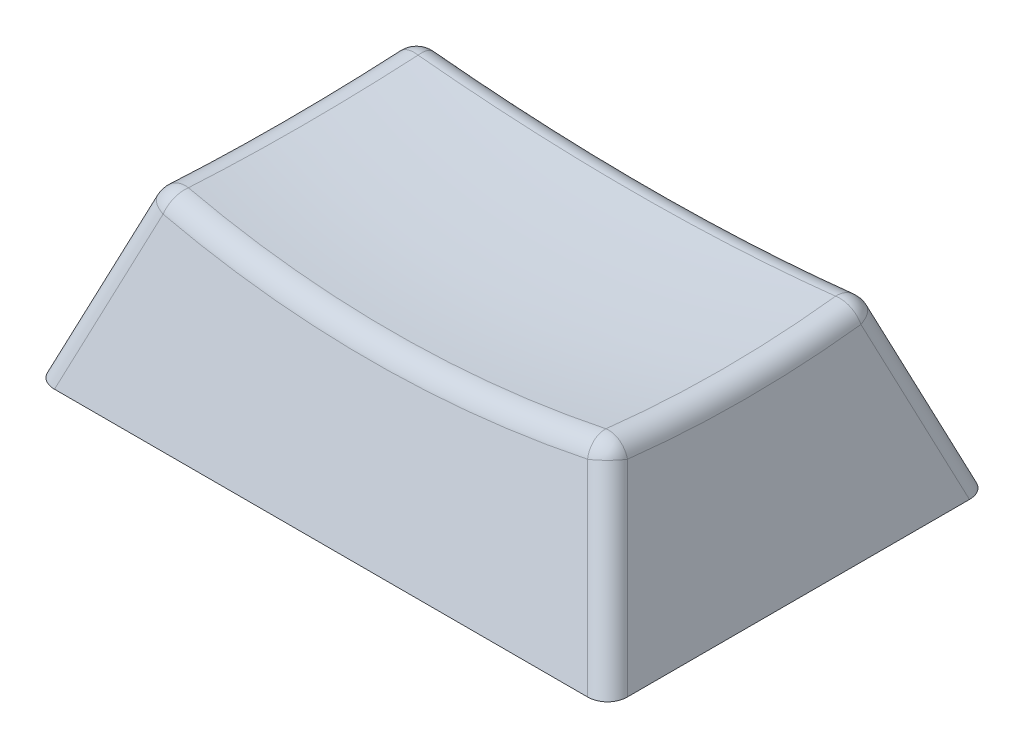
ISO-10303-21;
HEADER;
FILE_DESCRIPTION(('STEP AP214'),'2;1');
FILE_NAME('part.step','',(''),(''),'','','');
FILE_SCHEMA(('AUTOMOTIVE_DESIGN { 1 0 10303 214 1 1 1 1 }'));
ENDSEC;
DATA;
#1=APPLICATION_CONTEXT('core data for automotive mechanical design processes');
#2=APPLICATION_PROTOCOL_DEFINITION('international standard','automotive_design',2000,#1);
#3=PRODUCT_CONTEXT('',#1,'mechanical');
#4=PRODUCT('Part','Part','',(#3));
#5=PRODUCT_RELATED_PRODUCT_CATEGORY('part','',(#4));
#6=PRODUCT_DEFINITION_FORMATION('','',#4);
#7=PRODUCT_DEFINITION_CONTEXT('part definition',#1,'design');
#8=PRODUCT_DEFINITION('design','',#6,#7);
#9=PRODUCT_DEFINITION_SHAPE('','',#8);
#10=(LENGTH_UNIT() NAMED_UNIT(*) SI_UNIT(.MILLI.,.METRE.));
#11=(NAMED_UNIT(*) PLANE_ANGLE_UNIT() SI_UNIT($,.RADIAN.));
#12=(NAMED_UNIT(*) SI_UNIT($,.STERADIAN.) SOLID_ANGLE_UNIT());
#13=UNCERTAINTY_MEASURE_WITH_UNIT(LENGTH_MEASURE(1.E-05),#10,'distance_accuracy_value','');
#14=(GEOMETRIC_REPRESENTATION_CONTEXT(3) GLOBAL_UNCERTAINTY_ASSIGNED_CONTEXT((#13)) GLOBAL_UNIT_ASSIGNED_CONTEXT((#10,
#11,#12)) REPRESENTATION_CONTEXT('',''));
#15=CARTESIAN_POINT('',(0.,0.,0.));
#16=DIRECTION('',(0.,0.,1.));
#17=DIRECTION('',(1.,0.,0.));
#18=AXIS2_PLACEMENT_3D('',#15,#16,#17);
#19=CARTESIAN_POINT('',(-13.5,0.,9.));
#20=DIRECTION('',(-0.941470544812038,0.337095258423083,0.));
#21=DIRECTION('',(-0.337095258423083,-0.941470544812038,0.));
#22=AXIS2_PLACEMENT_3D('',#19,#20,#21);
#23=PLANE('',#22);
#24=DIRECTION('',(0.,0.,1.));
#25=VECTOR('',#24,1.);
#26=CARTESIAN_POINT('',(-13.5,0.,9.));
#27=LINE('',#26,#25);
#28=CARTESIAN_POINT('',(-13.5,0.,-8.05852945518796));
#29=VERTEX_POINT('',#28);
#30=CARTESIAN_POINT('',(-13.5,0.,8.05852945518797));
#31=VERTEX_POINT('',#30);
#32=EDGE_CURVE('E332',#29,#31,#27,.T.);
#33=ORIENTED_EDGE('',*,*,#32,.T.);
#34=DIRECTION('',(0.319434306340419,0.892145418564502,-0.31943430634042));
#35=VECTOR('',#34,1.);
#36=CARTESIAN_POINT('',(-13.5960660313607,-0.268302020343255,8.15459548654862));
#37=LINE('',#36,#35);
#38=CARTESIAN_POINT('',(-10.9418788490455,7.14455529558839,5.50040830423342));
#39=VERTEX_POINT('',#38);
#40=EDGE_CURVE('E364',#31,#39,#37,.T.);
#41=ORIENTED_EDGE('',*,*,#40,.T.);
#42=CARTESIAN_POINT('',(9.21190225068364,63.4318829807803,0.));
#43=DIRECTION('',(-0.941470544812038,0.337095258423083,0.));
#44=DIRECTION('',(-0.337095258423083,-0.941470544812038,0.));
#45=AXIS2_PLACEMENT_3D('',#42,#43,#44);
#46=CIRCLE('',#45,60.0390926153056);
#47=CARTESIAN_POINT('',(-10.9418788490455,7.14455529558838,-5.50040830423342));
#48=VERTEX_POINT('',#47);
#49=EDGE_CURVE('E360',#39,#48,#46,.F.);
#50=ORIENTED_EDGE('',*,*,#49,.T.);
#51=DIRECTION('',(0.319434306340419,0.892145418564502,0.319434306340419));
#52=VECTOR('',#51,1.);
#53=CARTESIAN_POINT('',(-11.7593770621513,4.86137133246757,-6.31790651733928));
#54=LINE('',#53,#52);
#55=EDGE_CURVE('E362',#48,#29,#54,.F.);
#56=ORIENTED_EDGE('',*,*,#55,.T.);
#57=EDGE_LOOP('',(#33,#41,#50,#56));
#58=FACE_BOUND('',#57,.T.);
#59=ADVANCED_FACE('F35',(#58),#23,.T.);
#60=CARTESIAN_POINT('',(13.5,0.,9.));
#61=DIRECTION('',(0.,0.337095258423083,0.941470544812038));
#62=DIRECTION('',(0.,-0.941470544812038,0.337095258423083));
#63=AXIS2_PLACEMENT_3D('',#60,#61,#62);
#64=PLANE('',#63);
#65=CARTESIAN_POINT('',(0.,62.0037393260752,-13.2005527910527));
#66=DIRECTION('',(0.,0.337095258423083,0.941470544812038));
#67=DIRECTION('',(0.,-0.941470544812038,0.337095258423083));
#68=AXIS2_PLACEMENT_3D('',#65,#66,#67);
#69=CIRCLE('',#68,59.1215980795354);
#70=CARTESIAN_POINT('',(10.0004083042334,7.14455529558838,6.44187884904546));
#71=VERTEX_POINT('',#70);
#72=CARTESIAN_POINT('',(-10.0004083042334,7.14455529558838,6.44187884904546));
#73=VERTEX_POINT('',#72);
#74=EDGE_CURVE('E347',#71,#73,#69,.F.);
#75=ORIENTED_EDGE('',*,*,#74,.T.);
#76=DIRECTION('',(0.31943430634042,0.892145418564502,-0.31943430634042));
#77=VECTOR('',#76,1.);
#78=CARTESIAN_POINT('',(-9.89956203273462,7.42620800887299,6.34103257754666));
#79=LINE('',#78,#77);
#80=CARTESIAN_POINT('',(-12.558529455188,0.,9.));
#81=VERTEX_POINT('',#80);
#82=EDGE_CURVE('E349',#73,#81,#79,.F.);
#83=ORIENTED_EDGE('',*,*,#82,.T.);
#84=DIRECTION('',(1.,0.,0.));
#85=VECTOR('',#84,1.);
#86=CARTESIAN_POINT('',(13.5,0.,9.));
#87=LINE('',#86,#85);
#88=CARTESIAN_POINT('',(12.558529455188,0.,9.));
#89=VERTEX_POINT('',#88);
#90=EDGE_CURVE('E335',#81,#89,#87,.T.);
#91=ORIENTED_EDGE('',*,*,#90,.T.);
#92=DIRECTION('',(-0.319434306340419,0.892145418564502,-0.319434306340419));
#93=VECTOR('',#92,1.);
#94=CARTESIAN_POINT('',(12.6545954865486,-0.268302020343255,9.09606603136065));
#95=LINE('',#94,#93);
#96=EDGE_CURVE('E345',#89,#71,#95,.T.);
#97=ORIENTED_EDGE('',*,*,#96,.T.);
#98=EDGE_LOOP('',(#75,#83,#91,#97));
#99=FACE_BOUND('',#98,.T.);
#100=ADVANCED_FACE('F455',(#99),#64,.T.);
#101=CARTESIAN_POINT('',(13.5,0.,9.));
#102=DIRECTION('',(0.941470544812038,0.337095258423083,0.));
#103=DIRECTION('',(-0.337095258423083,0.941470544812038,0.));
#104=AXIS2_PLACEMENT_3D('',#101,#102,#103);
#105=PLANE('',#104);
#106=CARTESIAN_POINT('',(-9.21190225068363,63.4318829807803,0.));
#107=DIRECTION('',(0.941470544812038,0.337095258423083,0.));
#108=DIRECTION('',(-0.337095258423083,0.941470544812038,0.));
#109=AXIS2_PLACEMENT_3D('',#106,#107,#108);
#110=CIRCLE('',#109,60.0390926153056);
#111=CARTESIAN_POINT('',(10.9418788490455,7.14455529558838,-5.50040830423342));
#112=VERTEX_POINT('',#111);
#113=CARTESIAN_POINT('',(10.9418788490455,7.14455529558838,5.50040830423342));
#114=VERTEX_POINT('',#113);
#115=EDGE_CURVE('E383',#112,#114,#110,.F.);
#116=ORIENTED_EDGE('',*,*,#115,.T.);
#117=DIRECTION('',(-0.319434306340419,0.892145418564502,-0.319434306340419));
#118=VECTOR('',#117,1.);
#119=CARTESIAN_POINT('',(13.5960660313607,-0.268302020343255,8.15459548654862));
#120=LINE('',#119,#118);
#121=CARTESIAN_POINT('',(13.5,0.,8.05852945518796));
#122=VERTEX_POINT('',#121);
#123=EDGE_CURVE('E43',#114,#122,#120,.F.);
#124=ORIENTED_EDGE('',*,*,#123,.T.);
#125=DIRECTION('',(0.,0.,-1.));
#126=VECTOR('',#125,1.);
#127=CARTESIAN_POINT('',(13.5,0.,9.));
#128=LINE('',#127,#126);
#129=CARTESIAN_POINT('',(13.5,0.,-8.05852945518796));
#130=VERTEX_POINT('',#129);
#131=EDGE_CURVE('E339',#122,#130,#128,.T.);
#132=ORIENTED_EDGE('',*,*,#131,.T.);
#133=DIRECTION('',(-0.319434306340419,0.892145418564502,0.31943430634042));
#134=VECTOR('',#133,1.);
#135=CARTESIAN_POINT('',(11.7593770621513,4.86137133246757,-6.31790651733929));
#136=LINE('',#135,#134);
#137=EDGE_CURVE('E381',#130,#112,#136,.T.);
#138=ORIENTED_EDGE('',*,*,#137,.T.);
#139=EDGE_LOOP('',(#116,#124,#132,#138));
#140=FACE_BOUND('',#139,.T.);
#141=ADVANCED_FACE('F443',(#140),#105,.T.);
#142=CARTESIAN_POINT('',(13.5,0.,-9.));
#143=DIRECTION('',(0.,0.337095258423083,-0.941470544812038));
#144=DIRECTION('',(0.,0.941470544812038,0.337095258423083));
#145=AXIS2_PLACEMENT_3D('',#142,#143,#144);
#146=PLANE('',#145);
#147=DIRECTION('',(-1.,0.,0.));
#148=VECTOR('',#147,1.);
#149=CARTESIAN_POINT('',(13.5,0.,-9.));
#150=LINE('',#149,#148);
#151=CARTESIAN_POINT('',(12.558529455188,0.,-9.));
#152=VERTEX_POINT('',#151);
#153=CARTESIAN_POINT('',(-12.558529455188,0.,-9.));
#154=VERTEX_POINT('',#153);
#155=EDGE_CURVE('E342',#152,#154,#150,.T.);
#156=ORIENTED_EDGE('',*,*,#155,.T.);
#157=DIRECTION('',(0.319434306340419,0.892145418564502,0.319434306340419));
#158=VECTOR('',#157,1.);
#159=CARTESIAN_POINT('',(-9.89956203273462,7.42620800887298,-6.34103257754666));
#160=LINE('',#159,#158);
#161=CARTESIAN_POINT('',(-10.0004083042334,7.14455529558838,-6.44187884904546));
#162=VERTEX_POINT('',#161);
#163=EDGE_CURVE('E370',#154,#162,#160,.T.);
#164=ORIENTED_EDGE('',*,*,#163,.T.);
#165=CARTESIAN_POINT('',(0.,62.0037393260752,13.2005527910527));
#166=DIRECTION('',(0.,0.337095258423083,-0.941470544812038));
#167=DIRECTION('',(0.,0.941470544812038,0.337095258423083));
#168=AXIS2_PLACEMENT_3D('',#165,#166,#167);
#169=CIRCLE('',#168,59.1215980795354);
#170=CARTESIAN_POINT('',(10.0004083042334,7.14455529558839,-6.44187884904545));
#171=VERTEX_POINT('',#170);
#172=EDGE_CURVE('E368',#162,#171,#169,.F.);
#173=ORIENTED_EDGE('',*,*,#172,.T.);
#174=DIRECTION('',(-0.31943430634042,0.892145418564502,0.31943430634042));
#175=VECTOR('',#174,1.);
#176=CARTESIAN_POINT('',(12.6545954865486,-0.268302020343256,-9.09606603136065));
#177=LINE('',#176,#175);
#178=EDGE_CURVE('E366',#171,#152,#177,.F.);
#179=ORIENTED_EDGE('',*,*,#178,.T.);
#180=EDGE_LOOP('',(#156,#164,#173,#179));
#181=FACE_BOUND('',#180,.T.);
#182=ADVANCED_FACE('F498',(#181),#146,.T.);
#183=CARTESIAN_POINT('',(0.,0.,0.));
#184=DIRECTION('',(0.,1.,0.));
#185=DIRECTION('',(0.,0.,1.));
#186=AXIS2_PLACEMENT_3D('',#183,#184,#185);
#187=PLANE('',#186);
#188=DIRECTION('',(0.,0.,-1.));
#189=VECTOR('',#188,1.);
#190=CARTESIAN_POINT('',(-11.9067478177987,0.,9.));
#191=LINE('',#190,#189);
#192=CARTESIAN_POINT('',(-11.9067478177987,0.,-7.40674781779872));
#193=VERTEX_POINT('',#192);
#194=CARTESIAN_POINT('',(-11.9067478177987,0.,7.40674781779873));
#195=VERTEX_POINT('',#194);
#196=EDGE_CURVE('E318',#193,#195,#191,.F.);
#197=ORIENTED_EDGE('',*,*,#196,.T.);
#198=DIRECTION('',(-1.,0.,0.));
#199=VECTOR('',#198,1.);
#200=CARTESIAN_POINT('',(13.5,0.,7.40674781779873));
#201=LINE('',#200,#199);
#202=CARTESIAN_POINT('',(11.9067478177987,0.,7.40674781779873));
#203=VERTEX_POINT('',#202);
#204=EDGE_CURVE('E326',#195,#203,#201,.F.);
#205=ORIENTED_EDGE('',*,*,#204,.T.);
#206=DIRECTION('',(0.,0.,1.));
#207=VECTOR('',#206,1.);
#208=CARTESIAN_POINT('',(11.9067478177987,0.,9.));
#209=LINE('',#208,#207);
#210=CARTESIAN_POINT('',(11.9067478177987,0.,-7.40674781779873));
#211=VERTEX_POINT('',#210);
#212=EDGE_CURVE('E328',#203,#211,#209,.F.);
#213=ORIENTED_EDGE('',*,*,#212,.T.);
#214=DIRECTION('',(1.,0.,0.));
#215=VECTOR('',#214,1.);
#216=CARTESIAN_POINT('',(13.5,0.,-7.40674781779873));
#217=LINE('',#216,#215);
#218=EDGE_CURVE('E214',#211,#193,#217,.F.);
#219=ORIENTED_EDGE('',*,*,#218,.T.);
#220=EDGE_LOOP('',(#197,#205,#213,#219));
#221=FACE_BOUND('',#220,.T.);
#222=ORIENTED_EDGE('',*,*,#90,.F.);
#223=CARTESIAN_POINT('',(-12.4378318785325,0.,7.93783187853249));
#224=DIRECTION('',(0.,1.,0.));
#225=DIRECTION('',(-0.707106781186547,0.,0.707106781186548));
#226=AXIS2_PLACEMENT_3D('',#223,#224,#225);
#227=ELLIPSE('',#226,1.12089349918878,1.);
#228=EDGE_CURVE('E358',#81,#31,#227,.F.);
#229=ORIENTED_EDGE('',*,*,#228,.T.);
#230=ORIENTED_EDGE('',*,*,#32,.F.);
#231=CARTESIAN_POINT('',(-12.4378318785325,0.,-7.93783187853248));
#232=DIRECTION('',(0.,1.,0.));
#233=DIRECTION('',(-0.707106781186548,0.,-0.707106781186547));
#234=AXIS2_PLACEMENT_3D('',#231,#232,#233);
#235=ELLIPSE('',#234,1.12089349918878,1.);
#236=EDGE_CURVE('E356',#29,#154,#235,.F.);
#237=ORIENTED_EDGE('',*,*,#236,.T.);
#238=ORIENTED_EDGE('',*,*,#155,.F.);
#239=CARTESIAN_POINT('',(12.4378318785325,0.,-7.93783187853249));
#240=DIRECTION('',(0.,1.,0.));
#241=DIRECTION('',(0.707106781186547,0.,-0.707106781186548));
#242=AXIS2_PLACEMENT_3D('',#239,#240,#241);
#243=ELLIPSE('',#242,1.12089349918878,1.);
#244=EDGE_CURVE('E352',#152,#130,#243,.F.);
#245=ORIENTED_EDGE('',*,*,#244,.T.);
#246=ORIENTED_EDGE('',*,*,#131,.F.);
#247=CARTESIAN_POINT('',(12.4378318785325,0.,7.93783187853249));
#248=DIRECTION('',(0.,1.,0.));
#249=DIRECTION('',(0.707106781186548,0.,0.707106781186547));
#250=AXIS2_PLACEMENT_3D('',#247,#248,#249);
#251=ELLIPSE('',#250,1.12089349918878,1.);
#252=EDGE_CURVE('E354',#122,#89,#251,.F.);
#253=ORIENTED_EDGE('',*,*,#252,.T.);
#254=EDGE_LOOP('',(#222,#229,#230,#237,#238,#245,#246,#253));
#255=FACE_BOUND('',#254,.T.);
#256=ADVANCED_FACE('F453',(#221,#255),#187,.F.);
#257=CARTESIAN_POINT('',(0.,66.7302215075393,0.));
#258=DIRECTION('',(0.866197194455934,0.,0.499702331710259));
#259=DIRECTION('',(0.,1.,0.));
#260=AXIS2_PLACEMENT_3D('',#257,#258,#259);
#261=SPHERICAL_SURFACE('',#260,60.);
#262=CARTESIAN_POINT('',(0.,61.7496535338797,13.9101868877358));
#263=DIRECTION('',(0.,0.337095258423083,-0.941470544812038));
#264=DIRECTION('',(0.,0.941470544812038,0.337095258423083));
#265=AXIS2_PLACEMENT_3D('',#262,#263,#264);
#266=CIRCLE('',#265,58.1523915536414);
#267=CARTESIAN_POINT('',(9.83646718449188,7.78980038913865,-5.41023767629517));
#268=VERTEX_POINT('',#267);
#269=CARTESIAN_POINT('',(-9.83646718449189,7.78980038913864,-5.41023767629517));
#270=VERTEX_POINT('',#269);
#271=EDGE_CURVE('E372',#268,#270,#266,.T.);
#272=ORIENTED_EDGE('',*,*,#271,.T.);
#273=CARTESIAN_POINT('',(9.98692406114328,63.1543849975241,0.));
#274=DIRECTION('',(-0.941470544812038,0.337095258423083,0.));
#275=DIRECTION('',(-0.337095258423083,-0.941470544812038,0.));
#276=AXIS2_PLACEMENT_3D('',#273,#274,#275);
#277=CIRCLE('',#276,59.0548451953826);
#278=CARTESIAN_POINT('',(-9.83646718449189,7.78980038913864,5.41023767629517));
#279=VERTEX_POINT('',#278);
#280=EDGE_CURVE('E378',#270,#279,#277,.T.);
#281=ORIENTED_EDGE('',*,*,#280,.T.);
#282=CARTESIAN_POINT('',(0.,61.7496535338797,-13.9101868877358));
#283=DIRECTION('',(0.,0.337095258423083,0.941470544812038));
#284=DIRECTION('',(0.,-0.941470544812038,0.337095258423083));
#285=AXIS2_PLACEMENT_3D('',#282,#283,#284);
#286=CIRCLE('',#285,58.1523915536414);
#287=CARTESIAN_POINT('',(9.83646718449189,7.78980038913865,5.41023767629517));
#288=VERTEX_POINT('',#287);
#289=EDGE_CURVE('E376',#279,#288,#286,.T.);
#290=ORIENTED_EDGE('',*,*,#289,.T.);
#291=CARTESIAN_POINT('',(-9.98692406114329,63.1543849975241,0.));
#292=DIRECTION('',(0.941470544812038,0.337095258423083,0.));
#293=DIRECTION('',(-0.337095258423083,0.941470544812038,0.));
#294=AXIS2_PLACEMENT_3D('',#291,#292,#293);
#295=CIRCLE('',#294,59.0548451953826);
#296=EDGE_CURVE('E374',#288,#268,#295,.T.);
#297=ORIENTED_EDGE('',*,*,#296,.T.);
#298=EDGE_LOOP('',(#272,#281,#290,#297));
#299=FACE_BOUND('',#298,.T.);
#300=ADVANCED_FACE('F434',(#299),#261,.F.);
#301=CARTESIAN_POINT('',(12.6545954865486,-0.605397278766338,-8.15459548654862));
#302=DIRECTION('',(0.31943430634042,-0.892145418564502,-0.31943430634042));
#303=DIRECTION('',(0.,0.337095258423083,-0.941470544812038));
#304=AXIS2_PLACEMENT_3D('',#301,#302,#303);
#305=CYLINDRICAL_SURFACE('',#304,1.);
#306=CARTESIAN_POINT('',(10.0004083042334,6.80746003716529,-5.50040830423342));
#307=DIRECTION('',(-0.319434306340419,0.892145418564498,0.319434306340431));
#308=DIRECTION('',(0.,-0.337095258423095,0.941470544812033));
#309=AXIS2_PLACEMENT_3D('',#306,#307,#308);
#310=CIRCLE('',#309,1.);
#311=EDGE_CURVE('E336',#112,#171,#310,.T.);
#312=ORIENTED_EDGE('',*,*,#311,.F.);
#313=ORIENTED_EDGE('',*,*,#137,.F.);
#314=ORIENTED_EDGE('',*,*,#244,.F.);
#315=ORIENTED_EDGE('',*,*,#178,.F.);
#316=EDGE_LOOP('',(#312,#313,#314,#315));
#317=FACE_BOUND('',#316,.T.);
#318=ADVANCED_FACE('F37',(#317),#305,.T.);
#319=CARTESIAN_POINT('',(10.0004083042334,6.80746003716531,-5.50040830423342));
#320=DIRECTION('',(0.,0.,1.));
#321=DIRECTION('',(1.,0.,0.));
#322=AXIS2_PLACEMENT_3D('',#319,#320,#321);
#323=SPHERICAL_SURFACE('',#322,1.);
#324=CARTESIAN_POINT('',(10.0004083042334,6.8074600371653,-5.50040830423342));
#325=DIRECTION('',(-0.0308825713044701,0.0862516766543405,-0.99579461490005));
#326=DIRECTION('',(0.,0.996269816035879,0.0862928366426554));
#327=AXIS2_PLACEMENT_3D('',#324,#325,#326);
#328=CIRCLE('',#327,1.);
#329=EDGE_CURVE('E411',#112,#268,#328,.F.);
#330=ORIENTED_EDGE('',*,*,#329,.F.);
#331=ORIENTED_EDGE('',*,*,#311,.T.);
#332=CARTESIAN_POINT('',(10.0004083042334,6.8074600371653,-5.50040830423342));
#333=DIRECTION('',(0.985590348361583,0.159249583237987,0.0570196058827256));
#334=DIRECTION('',(-0.159509095156087,0.987196458949528,0.));
#335=AXIS2_PLACEMENT_3D('',#332,#333,#334);
#336=CIRCLE('',#335,1.);
#337=EDGE_CURVE('E414',#268,#171,#336,.F.);
#338=ORIENTED_EDGE('',*,*,#337,.F.);
#339=EDGE_LOOP('',(#330,#331,#338));
#340=FACE_BOUND('',#339,.T.);
#341=ADVANCED_FACE('F421',(#340),#323,.T.);
#342=CARTESIAN_POINT('',(-10.8179065173393,4.52427607404449,-6.31790651733929));
#343=DIRECTION('',(-0.31943430634042,-0.892145418564502,-0.319434306340419));
#344=DIRECTION('',(0.941470544812038,-0.337095258423083,0.));
#345=AXIS2_PLACEMENT_3D('',#342,#343,#344);
#346=CYLINDRICAL_SURFACE('',#345,1.);
#347=ORIENTED_EDGE('',*,*,#236,.F.);
#348=ORIENTED_EDGE('',*,*,#55,.F.);
#349=CARTESIAN_POINT('',(-10.0004083042334,6.80746003716529,-5.50040830423342));
#350=DIRECTION('',(0.319434306340422,0.892145418564501,0.31943430634042));
#351=DIRECTION('',(-0.941470544812037,0.337095258423085,0.));
#352=AXIS2_PLACEMENT_3D('',#349,#350,#351);
#353=CIRCLE('',#352,1.);
#354=EDGE_CURVE('E408',#162,#48,#353,.T.);
#355=ORIENTED_EDGE('',*,*,#354,.F.);
#356=ORIENTED_EDGE('',*,*,#163,.F.);
#357=EDGE_LOOP('',(#347,#348,#355,#356));
#358=FACE_BOUND('',#357,.T.);
#359=ADVANCED_FACE('F469',(#358),#346,.T.);
#360=CARTESIAN_POINT('',(0.,61.6666440676521,14.1420233358647));
#361=DIRECTION('',(0.,0.337095258423083,-0.941470544812038));
#362=DIRECTION('',(0.,0.941470544812038,0.337095258423083));
#363=AXIS2_PLACEMENT_3D('',#360,#361,#362);
#364=TOROIDAL_SURFACE('',#363,59.1215980795354,1.);
#365=ORIENTED_EDGE('',*,*,#337,.T.);
#366=ORIENTED_EDGE('',*,*,#172,.F.);
#367=CARTESIAN_POINT('',(-10.0004083042334,6.8074600371653,-5.50040830423342));
#368=DIRECTION('',(-0.985590348361584,0.159249583237982,0.0570196058827236));
#369=DIRECTION('',(-0.159509095156082,-0.987196458949528,0.));
#370=AXIS2_PLACEMENT_3D('',#367,#368,#369);
#371=CIRCLE('',#370,1.);
#372=EDGE_CURVE('E405',#270,#162,#371,.T.);
#373=ORIENTED_EDGE('',*,*,#372,.F.);
#374=ORIENTED_EDGE('',*,*,#271,.F.);
#375=EDGE_LOOP('',(#365,#366,#373,#374));
#376=FACE_BOUND('',#375,.T.);
#377=ADVANCED_FACE('F429',(#376),#364,.T.);
#378=CARTESIAN_POINT('',(-10.1533727954957,63.0947877223572,0.));
#379=DIRECTION('',(0.941470544812038,0.337095258423083,0.));
#380=DIRECTION('',(-0.337095258423083,0.941470544812038,0.));
#381=AXIS2_PLACEMENT_3D('',#378,#379,#380);
#382=TOROIDAL_SURFACE('',#381,60.0390926153056,1.);
#383=ORIENTED_EDGE('',*,*,#329,.T.);
#384=ORIENTED_EDGE('',*,*,#296,.F.);
#385=CARTESIAN_POINT('',(10.0004083042334,6.80746003716529,5.50040830423342));
#386=DIRECTION('',(-0.030882571304473,0.0862516766543395,0.99579461490005));
#387=DIRECTION('',(0.,-0.996269816035879,0.0862928366426544));
#388=AXIS2_PLACEMENT_3D('',#385,#386,#387);
#389=CIRCLE('',#388,1.);
#390=EDGE_CURVE('E402',#114,#288,#389,.T.);
#391=ORIENTED_EDGE('',*,*,#390,.F.);
#392=ORIENTED_EDGE('',*,*,#115,.F.);
#393=EDGE_LOOP('',(#383,#384,#391,#392));
#394=FACE_BOUND('',#393,.T.);
#395=ADVANCED_FACE('F440',(#394),#382,.T.);
#396=CARTESIAN_POINT('',(12.6545954865486,-0.605397278766338,8.15459548654862));
#397=DIRECTION('',(0.31943430634042,-0.892145418564502,0.319434306340419));
#398=DIRECTION('',(0.941470544812038,0.337095258423083,0.));
#399=AXIS2_PLACEMENT_3D('',#396,#397,#398);
#400=CYLINDRICAL_SURFACE('',#399,1.);
#401=ORIENTED_EDGE('',*,*,#252,.F.);
#402=ORIENTED_EDGE('',*,*,#123,.F.);
#403=CARTESIAN_POINT('',(10.0004083042334,6.8074600371653,5.50040830423342));
#404=DIRECTION('',(-0.319434306340412,0.892145418564504,-0.31943430634042));
#405=DIRECTION('',(0.,0.337095258423083,0.941470544812038));
#406=AXIS2_PLACEMENT_3D('',#403,#404,#405);
#407=CIRCLE('',#406,1.);
#408=EDGE_CURVE('E399',#71,#114,#407,.T.);
#409=ORIENTED_EDGE('',*,*,#408,.F.);
#410=ORIENTED_EDGE('',*,*,#96,.F.);
#411=EDGE_LOOP('',(#401,#402,#409,#410));
#412=FACE_BOUND('',#411,.T.);
#413=ADVANCED_FACE('F448',(#412),#400,.T.);
#414=CARTESIAN_POINT('',(-10.0004083042334,6.8074600371653,-5.50040830423342));
#415=DIRECTION('',(0.,0.,1.));
#416=DIRECTION('',(1.,0.,0.));
#417=AXIS2_PLACEMENT_3D('',#414,#415,#416);
#418=SPHERICAL_SURFACE('',#417,1.);
#419=ORIENTED_EDGE('',*,*,#372,.T.);
#420=ORIENTED_EDGE('',*,*,#354,.T.);
#421=CARTESIAN_POINT('',(-10.0004083042334,6.8074600371653,-5.50040830423342));
#422=DIRECTION('',(0.0308825713044717,0.0862516766543359,-0.995794614900051));
#423=DIRECTION('',(0.,0.996269816035879,0.0862928366426507));
#424=AXIS2_PLACEMENT_3D('',#421,#422,#423);
#425=CIRCLE('',#424,1.);
#426=EDGE_CURVE('E396',#270,#48,#425,.F.);
#427=ORIENTED_EDGE('',*,*,#426,.F.);
#428=EDGE_LOOP('',(#419,#420,#427));
#429=FACE_BOUND('',#428,.T.);
#430=ADVANCED_FACE('F472',(#429),#418,.T.);
#431=CARTESIAN_POINT('',(10.0004083042334,6.80746003716531,5.50040830423342));
#432=DIRECTION('',(0.,0.,1.));
#433=DIRECTION('',(1.,0.,0.));
#434=AXIS2_PLACEMENT_3D('',#431,#432,#433);
#435=SPHERICAL_SURFACE('',#434,1.);
#436=ORIENTED_EDGE('',*,*,#408,.T.);
#437=ORIENTED_EDGE('',*,*,#390,.T.);
#438=CARTESIAN_POINT('',(10.0004083042334,6.80746003716531,5.50040830423342));
#439=DIRECTION('',(0.985590348361584,0.159249583237982,-0.0570196058827245));
#440=DIRECTION('',(-0.159509095156082,0.987196458949528,0.));
#441=AXIS2_PLACEMENT_3D('',#438,#439,#440);
#442=CIRCLE('',#441,1.);
#443=EDGE_CURVE('E393',#71,#288,#442,.F.);
#444=ORIENTED_EDGE('',*,*,#443,.F.);
#445=EDGE_LOOP('',(#436,#437,#444));
#446=FACE_BOUND('',#445,.T.);
#447=ADVANCED_FACE('F480',(#446),#435,.T.);
#448=CARTESIAN_POINT('',(10.1533727954957,63.0947877223572,0.));
#449=DIRECTION('',(-0.941470544812038,0.337095258423083,0.));
#450=DIRECTION('',(-0.337095258423083,-0.941470544812038,0.));
#451=AXIS2_PLACEMENT_3D('',#448,#449,#450);
#452=TOROIDAL_SURFACE('',#451,60.0390926153056,1.);
#453=ORIENTED_EDGE('',*,*,#426,.T.);
#454=ORIENTED_EDGE('',*,*,#49,.F.);
#455=CARTESIAN_POINT('',(-10.0004083042334,6.8074600371653,5.50040830423342));
#456=DIRECTION('',(0.0308825713044729,0.0862516766543401,0.99579461490005));
#457=DIRECTION('',(0.,-0.996269816035879,0.0862928366426549));
#458=AXIS2_PLACEMENT_3D('',#455,#456,#457);
#459=CIRCLE('',#458,1.);
#460=EDGE_CURVE('E390',#279,#39,#459,.T.);
#461=ORIENTED_EDGE('',*,*,#460,.F.);
#462=ORIENTED_EDGE('',*,*,#280,.F.);
#463=EDGE_LOOP('',(#453,#454,#461,#462));
#464=FACE_BOUND('',#463,.T.);
#465=ADVANCED_FACE('F474',(#464),#452,.T.);
#466=CARTESIAN_POINT('',(0.,61.6666440676521,-14.1420233358647));
#467=DIRECTION('',(0.,0.337095258423083,0.941470544812038));
#468=DIRECTION('',(0.,-0.941470544812038,0.337095258423083));
#469=AXIS2_PLACEMENT_3D('',#466,#467,#468);
#470=TOROIDAL_SURFACE('',#469,59.1215980795354,1.);
#471=ORIENTED_EDGE('',*,*,#443,.T.);
#472=ORIENTED_EDGE('',*,*,#289,.F.);
#473=CARTESIAN_POINT('',(-10.0004083042334,6.8074600371653,5.50040830423342));
#474=DIRECTION('',(-0.985590348361584,0.159249583237978,-0.0570196058827226));
#475=DIRECTION('',(-0.159509095156078,-0.987196458949529,0.));
#476=AXIS2_PLACEMENT_3D('',#473,#474,#475);
#477=CIRCLE('',#476,1.);
#478=EDGE_CURVE('E388',#73,#279,#477,.T.);
#479=ORIENTED_EDGE('',*,*,#478,.F.);
#480=ORIENTED_EDGE('',*,*,#74,.F.);
#481=EDGE_LOOP('',(#471,#472,#479,#480));
#482=FACE_BOUND('',#481,.T.);
#483=ADVANCED_FACE('F478',(#482),#470,.T.);
#484=CARTESIAN_POINT('',(-10.0004083042334,6.8074600371653,5.50040830423342));
#485=DIRECTION('',(0.,0.,1.));
#486=DIRECTION('',(1.,0.,0.));
#487=AXIS2_PLACEMENT_3D('',#484,#485,#486);
#488=SPHERICAL_SURFACE('',#487,1.);
#489=ORIENTED_EDGE('',*,*,#478,.T.);
#490=ORIENTED_EDGE('',*,*,#460,.T.);
#491=CARTESIAN_POINT('',(-10.0004083042334,6.8074600371653,5.50040830423342));
#492=DIRECTION('',(0.319434306340421,0.892145418564506,-0.319434306340406));
#493=DIRECTION('',(-0.941470544812037,0.337095258423083,0.));
#494=AXIS2_PLACEMENT_3D('',#491,#492,#493);
#495=CIRCLE('',#494,1.);
#496=EDGE_CURVE('E322',#73,#39,#495,.F.);
#497=ORIENTED_EDGE('',*,*,#496,.F.);
#498=EDGE_LOOP('',(#489,#490,#497));
#499=FACE_BOUND('',#498,.T.);
#500=ADVANCED_FACE('F507',(#499),#488,.T.);
#501=CARTESIAN_POINT('',(-9.89956203273462,7.0891127504499,5.39956203273463));
#502=DIRECTION('',(-0.31943430634042,-0.892145418564502,0.31943430634042));
#503=DIRECTION('',(0.,-0.337095258423083,-0.941470544812038));
#504=AXIS2_PLACEMENT_3D('',#501,#502,#503);
#505=CYLINDRICAL_SURFACE('',#504,1.);
#506=ORIENTED_EDGE('',*,*,#496,.T.);
#507=ORIENTED_EDGE('',*,*,#40,.F.);
#508=ORIENTED_EDGE('',*,*,#228,.F.);
#509=ORIENTED_EDGE('',*,*,#82,.F.);
#510=EDGE_LOOP('',(#506,#507,#508,#509));
#511=FACE_BOUND('',#510,.T.);
#512=ADVANCED_FACE('F460',(#511),#505,.T.);
#513=CARTESIAN_POINT('',(-12.0877941827819,-0.505642887634624,9.));
#514=DIRECTION('',(-0.941470544812038,0.337095258423083,0.));
#515=DIRECTION('',(-0.337095258423083,-0.941470544812038,0.));
#516=AXIS2_PLACEMENT_3D('',#513,#514,#515);
#517=PLANE('',#516);
#518=DIRECTION('',(0.,0.,-1.));
#519=VECTOR('',#518,1.);
#520=CARTESIAN_POINT('',(-10.2015259422057,4.7625,0.));
#521=LINE('',#520,#519);
#522=CARTESIAN_POINT('',(-10.2015259422057,4.7625,-5.70152594220574));
#523=VERTEX_POINT('',#522);
#524=CARTESIAN_POINT('',(-10.2015259422057,4.7625,5.70152594220575));
#525=VERTEX_POINT('',#524);
#526=EDGE_CURVE('E50',#523,#525,#521,.F.);
#527=ORIENTED_EDGE('',*,*,#526,.T.);
#528=DIRECTION('',(0.31943430634042,0.892145418564502,-0.31943430634042));
#529=VECTOR('',#528,1.);
#530=CARTESIAN_POINT('',(-12.2318932298229,-0.908095918149508,7.73189322982293));
#531=LINE('',#530,#529);
#532=EDGE_CURVE('E219',#195,#525,#531,.T.);
#533=ORIENTED_EDGE('',*,*,#532,.F.);
#534=ORIENTED_EDGE('',*,*,#196,.F.);
#535=DIRECTION('',(-0.31943430634042,-0.892145418564502,-0.319434306340419));
#536=VECTOR('',#535,1.);
#537=CARTESIAN_POINT('',(-10.3952042606136,4.22157743466132,-5.89520426061359));
#538=LINE('',#537,#536);
#539=EDGE_CURVE('E320',#523,#193,#538,.T.);
#540=ORIENTED_EDGE('',*,*,#539,.F.);
#541=EDGE_LOOP('',(#527,#533,#534,#540));
#542=FACE_BOUND('',#541,.T.);
#543=ADVANCED_FACE('F506',(#542),#517,.F.);
#544=CARTESIAN_POINT('',(13.5,-0.505642887634624,7.58779418278194));
#545=DIRECTION('',(0.,0.337095258423083,0.941470544812038));
#546=DIRECTION('',(0.,-0.941470544812038,0.337095258423083));
#547=AXIS2_PLACEMENT_3D('',#544,#545,#546);
#548=PLANE('',#547);
#549=DIRECTION('',(-1.,0.,0.));
#550=VECTOR('',#549,1.);
#551=CARTESIAN_POINT('',(0.,4.7625,5.70152594220574));
#552=LINE('',#551,#550);
#553=CARTESIAN_POINT('',(10.2015259422057,4.7625,5.70152594220574));
#554=VERTEX_POINT('',#553);
#555=EDGE_CURVE('E57',#525,#554,#552,.F.);
#556=ORIENTED_EDGE('',*,*,#555,.T.);
#557=DIRECTION('',(0.31943430634042,-0.892145418564502,0.319434306340419));
#558=VECTOR('',#557,1.);
#559=CARTESIAN_POINT('',(12.2318932298229,-0.908095918149508,7.73189322982292));
#560=LINE('',#559,#558);
#561=EDGE_CURVE('E218',#554,#203,#560,.T.);
#562=ORIENTED_EDGE('',*,*,#561,.T.);
#563=ORIENTED_EDGE('',*,*,#204,.F.);
#564=ORIENTED_EDGE('',*,*,#532,.T.);
#565=EDGE_LOOP('',(#556,#562,#563,#564));
#566=FACE_BOUND('',#565,.T.);
#567=ADVANCED_FACE('F530',(#566),#548,.F.);
#568=CARTESIAN_POINT('',(12.0877941827819,-0.505642887634624,9.));
#569=DIRECTION('',(0.941470544812038,0.337095258423083,0.));
#570=DIRECTION('',(-0.337095258423083,0.941470544812038,0.));
#571=AXIS2_PLACEMENT_3D('',#568,#569,#570);
#572=PLANE('',#571);
#573=DIRECTION('',(0.,0.,1.));
#574=VECTOR('',#573,1.);
#575=CARTESIAN_POINT('',(10.2015259422057,4.7625,0.));
#576=LINE('',#575,#574);
#577=CARTESIAN_POINT('',(10.2015259422057,4.7625,-5.70152594220574));
#578=VERTEX_POINT('',#577);
#579=EDGE_CURVE('E222',#554,#578,#576,.F.);
#580=ORIENTED_EDGE('',*,*,#579,.T.);
#581=DIRECTION('',(-0.31943430634042,0.892145418564502,0.31943430634042));
#582=VECTOR('',#581,1.);
#583=CARTESIAN_POINT('',(10.3952042606136,4.22157743466132,-5.89520426061359));
#584=LINE('',#583,#582);
#585=EDGE_CURVE('E208',#211,#578,#584,.T.);
#586=ORIENTED_EDGE('',*,*,#585,.F.);
#587=ORIENTED_EDGE('',*,*,#212,.F.);
#588=ORIENTED_EDGE('',*,*,#561,.F.);
#589=EDGE_LOOP('',(#580,#586,#587,#588));
#590=FACE_BOUND('',#589,.T.);
#591=ADVANCED_FACE('F223',(#590),#572,.F.);
#592=CARTESIAN_POINT('',(13.5,-0.505642887634624,-7.58779418278194));
#593=DIRECTION('',(0.,0.337095258423083,-0.941470544812038));
#594=DIRECTION('',(0.,0.941470544812038,0.337095258423083));
#595=AXIS2_PLACEMENT_3D('',#592,#593,#594);
#596=PLANE('',#595);
#597=DIRECTION('',(1.,0.,0.));
#598=VECTOR('',#597,1.);
#599=CARTESIAN_POINT('',(0.,4.7625,-5.70152594220574));
#600=LINE('',#599,#598);
#601=EDGE_CURVE('E212',#578,#523,#600,.F.);
#602=ORIENTED_EDGE('',*,*,#601,.T.);
#603=ORIENTED_EDGE('',*,*,#539,.T.);
#604=ORIENTED_EDGE('',*,*,#218,.F.);
#605=ORIENTED_EDGE('',*,*,#585,.T.);
#606=EDGE_LOOP('',(#602,#603,#604,#605));
#607=FACE_BOUND('',#606,.T.);
#608=ADVANCED_FACE('F210',(#607),#596,.F.);
#609=CARTESIAN_POINT('',(0.,4.7625,0.));
#610=DIRECTION('',(0.,-1.,0.));
#611=DIRECTION('',(0.,0.,-1.));
#612=AXIS2_PLACEMENT_3D('',#609,#610,#611);
#613=PLANE('',#612);
#614=CARTESIAN_POINT('',(0.,4.7625,0.));
#615=DIRECTION('',(0.,-1.,0.));
#616=DIRECTION('',(0.,0.,-1.));
#617=AXIS2_PLACEMENT_3D('',#614,#615,#616);
#618=CIRCLE('',#617,2.75);
#619=CARTESIAN_POINT('',(0.,4.7625,-2.75));
#620=VERTEX_POINT('',#619);
#621=EDGE_CURVE('E11',#620,#620,#618,.F.);
#622=ORIENTED_EDGE('',*,*,#621,.T.);
#623=EDGE_LOOP('',(#622));
#624=FACE_BOUND('',#623,.T.);
#625=ORIENTED_EDGE('',*,*,#579,.F.);
#626=ORIENTED_EDGE('',*,*,#555,.F.);
#627=ORIENTED_EDGE('',*,*,#526,.F.);
#628=ORIENTED_EDGE('',*,*,#601,.F.);
#629=EDGE_LOOP('',(#625,#626,#627,#628));
#630=FACE_BOUND('',#629,.T.);
#631=ADVANCED_FACE('F226',(#624,#630),#613,.T.);
#632=CARTESIAN_POINT('',(0.,4.7625,0.));
#633=DIRECTION('',(0.,-1.,0.));
#634=DIRECTION('',(0.,0.,-1.));
#635=AXIS2_PLACEMENT_3D('',#632,#633,#634);
#636=PLANE('',#635);
#637=DIRECTION('',(1.,0.,0.));
#638=VECTOR('',#637,1.);
#639=CARTESIAN_POINT('',(0.,4.7625,-2.05));
#640=LINE('',#639,#638);
#641=CARTESIAN_POINT('',(-0.55,4.7625,-2.05));
#642=VERTEX_POINT('',#641);
#643=CARTESIAN_POINT('',(0.550000000000001,4.7625,-2.05));
#644=VERTEX_POINT('',#643);
#645=EDGE_CURVE('E251',#642,#644,#640,.T.);
#646=ORIENTED_EDGE('',*,*,#645,.T.);
#647=DIRECTION('',(0.,0.,1.));
#648=VECTOR('',#647,1.);
#649=CARTESIAN_POINT('',(0.550000000000001,4.7625,0.));
#650=LINE('',#649,#648);
#651=CARTESIAN_POINT('',(0.550000000000001,4.7625,-0.55));
#652=VERTEX_POINT('',#651);
#653=EDGE_CURVE('E253',#644,#652,#650,.T.);
#654=ORIENTED_EDGE('',*,*,#653,.T.);
#655=DIRECTION('',(1.,0.,0.));
#656=VECTOR('',#655,1.);
#657=CARTESIAN_POINT('',(0.,4.7625,-0.55));
#658=LINE('',#657,#656);
#659=CARTESIAN_POINT('',(2.05,4.7625,-0.55));
#660=VERTEX_POINT('',#659);
#661=EDGE_CURVE('E233',#652,#660,#658,.T.);
#662=ORIENTED_EDGE('',*,*,#661,.T.);
#663=DIRECTION('',(0.,0.,1.));
#664=VECTOR('',#663,1.);
#665=CARTESIAN_POINT('',(2.05,4.7625,0.));
#666=LINE('',#665,#664);
#667=CARTESIAN_POINT('',(2.05,4.7625,0.55));
#668=VERTEX_POINT('',#667);
#669=EDGE_CURVE('E228',#660,#668,#666,.T.);
#670=ORIENTED_EDGE('',*,*,#669,.T.);
#671=DIRECTION('',(-1.,0.,0.));
#672=VECTOR('',#671,1.);
#673=CARTESIAN_POINT('',(0.,4.7625,0.55));
#674=LINE('',#673,#672);
#675=CARTESIAN_POINT('',(0.55,4.7625,0.55));
#676=VERTEX_POINT('',#675);
#677=EDGE_CURVE('E235',#668,#676,#674,.T.);
#678=ORIENTED_EDGE('',*,*,#677,.T.);
#679=DIRECTION('',(0.,0.,1.));
#680=VECTOR('',#679,1.);
#681=CARTESIAN_POINT('',(0.550000000000001,4.7625,0.));
#682=LINE('',#681,#680);
#683=CARTESIAN_POINT('',(0.55,4.7625,2.05));
#684=VERTEX_POINT('',#683);
#685=EDGE_CURVE('E237',#676,#684,#682,.T.);
#686=ORIENTED_EDGE('',*,*,#685,.T.);
#687=DIRECTION('',(-1.,0.,0.));
#688=VECTOR('',#687,1.);
#689=CARTESIAN_POINT('',(0.,4.7625,2.05));
#690=LINE('',#689,#688);
#691=CARTESIAN_POINT('',(-0.55,4.7625,2.05));
#692=VERTEX_POINT('',#691);
#693=EDGE_CURVE('E239',#684,#692,#690,.T.);
#694=ORIENTED_EDGE('',*,*,#693,.T.);
#695=DIRECTION('',(0.,0.,-1.));
#696=VECTOR('',#695,1.);
#697=CARTESIAN_POINT('',(-0.55,4.7625,0.));
#698=LINE('',#697,#696);
#699=CARTESIAN_POINT('',(-0.55,4.7625,0.55));
#700=VERTEX_POINT('',#699);
#701=EDGE_CURVE('E241',#692,#700,#698,.T.);
#702=ORIENTED_EDGE('',*,*,#701,.T.);
#703=DIRECTION('',(-1.,0.,0.));
#704=VECTOR('',#703,1.);
#705=CARTESIAN_POINT('',(0.,4.7625,0.55));
#706=LINE('',#705,#704);
#707=CARTESIAN_POINT('',(-2.05,4.7625,0.55));
#708=VERTEX_POINT('',#707);
#709=EDGE_CURVE('E243',#700,#708,#706,.T.);
#710=ORIENTED_EDGE('',*,*,#709,.T.);
#711=DIRECTION('',(0.,0.,-1.));
#712=VECTOR('',#711,1.);
#713=CARTESIAN_POINT('',(-2.05,4.7625,0.));
#714=LINE('',#713,#712);
#715=CARTESIAN_POINT('',(-2.05,4.7625,-0.550000000000001));
#716=VERTEX_POINT('',#715);
#717=EDGE_CURVE('E245',#708,#716,#714,.T.);
#718=ORIENTED_EDGE('',*,*,#717,.T.);
#719=DIRECTION('',(1.,0.,0.));
#720=VECTOR('',#719,1.);
#721=CARTESIAN_POINT('',(0.,4.7625,-0.55));
#722=LINE('',#721,#720);
#723=CARTESIAN_POINT('',(-0.55,4.7625,-0.55));
#724=VERTEX_POINT('',#723);
#725=EDGE_CURVE('E247',#716,#724,#722,.T.);
#726=ORIENTED_EDGE('',*,*,#725,.T.);
#727=DIRECTION('',(0.,0.,-1.));
#728=VECTOR('',#727,1.);
#729=CARTESIAN_POINT('',(-0.55,4.7625,0.));
#730=LINE('',#729,#728);
#731=EDGE_CURVE('E249',#724,#642,#730,.T.);
#732=ORIENTED_EDGE('',*,*,#731,.T.);
#733=EDGE_LOOP('',(#646,#654,#662,#670,#678,#686,#694,#702,#710,#718,#726,#732));
#734=FACE_BOUND('',#733,.T.);
#735=ADVANCED_FACE('F556',(#734),#636,.T.);
#736=CARTESIAN_POINT('',(0.55,7.80846003716531,0.55));
#737=DIRECTION('',(0.,0.,1.));
#738=DIRECTION('',(1.,0.,0.));
#739=AXIS2_PLACEMENT_3D('',#736,#737,#738);
#740=PLANE('',#739);
#741=DIRECTION('',(0.,-1.,0.));
#742=VECTOR('',#741,1.);
#743=CARTESIAN_POINT('',(0.55,7.80846003716531,0.55));
#744=LINE('',#743,#742);
#745=CARTESIAN_POINT('',(0.55,0.,0.55));
#746=VERTEX_POINT('',#745);
#747=EDGE_CURVE('E313',#676,#746,#744,.T.);
#748=ORIENTED_EDGE('',*,*,#747,.F.);
#749=ORIENTED_EDGE('',*,*,#677,.F.);
#750=DIRECTION('',(0.,-1.,0.));
#751=VECTOR('',#750,1.);
#752=CARTESIAN_POINT('',(2.05,7.80846003716531,0.55));
#753=LINE('',#752,#751);
#754=CARTESIAN_POINT('',(2.05,0.,0.55));
#755=VERTEX_POINT('',#754);
#756=EDGE_CURVE('E291',#668,#755,#753,.T.);
#757=ORIENTED_EDGE('',*,*,#756,.T.);
#758=DIRECTION('',(-1.,0.,0.));
#759=VECTOR('',#758,1.);
#760=CARTESIAN_POINT('',(0.55,0.,0.55));
#761=LINE('',#760,#759);
#762=EDGE_CURVE('E255',#755,#746,#761,.T.);
#763=ORIENTED_EDGE('',*,*,#762,.T.);
#764=EDGE_LOOP('',(#748,#749,#757,#763));
#765=FACE_BOUND('',#764,.T.);
#766=ADVANCED_FACE('F564',(#765),#740,.F.);
#767=CARTESIAN_POINT('',(0.55,7.80846003716531,2.05));
#768=DIRECTION('',(1.,0.,0.));
#769=DIRECTION('',(0.,0.,-1.));
#770=AXIS2_PLACEMENT_3D('',#767,#768,#769);
#771=PLANE('',#770);
#772=DIRECTION('',(0.,-1.,0.));
#773=VECTOR('',#772,1.);
#774=CARTESIAN_POINT('',(0.55,7.80846003716531,2.05));
#775=LINE('',#774,#773);
#776=CARTESIAN_POINT('',(0.55,0.,2.05));
#777=VERTEX_POINT('',#776);
#778=EDGE_CURVE('E311',#684,#777,#775,.T.);
#779=ORIENTED_EDGE('',*,*,#778,.F.);
#780=ORIENTED_EDGE('',*,*,#685,.F.);
#781=ORIENTED_EDGE('',*,*,#747,.T.);
#782=DIRECTION('',(0.,0.,1.));
#783=VECTOR('',#782,1.);
#784=CARTESIAN_POINT('',(0.55,0.,2.05));
#785=LINE('',#784,#783);
#786=EDGE_CURVE('E258',#746,#777,#785,.T.);
#787=ORIENTED_EDGE('',*,*,#786,.T.);
#788=EDGE_LOOP('',(#779,#780,#781,#787));
#789=FACE_BOUND('',#788,.T.);
#790=ADVANCED_FACE('F572',(#789),#771,.F.);
#791=CARTESIAN_POINT('',(-0.55,7.80846003716531,2.05));
#792=DIRECTION('',(0.,0.,1.));
#793=DIRECTION('',(1.,0.,0.));
#794=AXIS2_PLACEMENT_3D('',#791,#792,#793);
#795=PLANE('',#794);
#796=DIRECTION('',(0.,-1.,0.));
#797=VECTOR('',#796,1.);
#798=CARTESIAN_POINT('',(-0.55,7.80846003716531,2.05));
#799=LINE('',#798,#797);
#800=CARTESIAN_POINT('',(-0.55,0.,2.05));
#801=VERTEX_POINT('',#800);
#802=EDGE_CURVE('E309',#692,#801,#799,.T.);
#803=ORIENTED_EDGE('',*,*,#802,.F.);
#804=ORIENTED_EDGE('',*,*,#693,.F.);
#805=ORIENTED_EDGE('',*,*,#778,.T.);
#806=DIRECTION('',(-1.,0.,0.));
#807=VECTOR('',#806,1.);
#808=CARTESIAN_POINT('',(-0.55,0.,2.05));
#809=LINE('',#808,#807);
#810=EDGE_CURVE('E261',#777,#801,#809,.T.);
#811=ORIENTED_EDGE('',*,*,#810,.T.);
#812=EDGE_LOOP('',(#803,#804,#805,#811));
#813=FACE_BOUND('',#812,.T.);
#814=ADVANCED_FACE('F580',(#813),#795,.F.);
#815=CARTESIAN_POINT('',(-0.55,7.80846003716531,0.55));
#816=DIRECTION('',(-1.,0.,0.));
#817=DIRECTION('',(0.,0.,1.));
#818=AXIS2_PLACEMENT_3D('',#815,#816,#817);
#819=PLANE('',#818);
#820=DIRECTION('',(0.,-1.,0.));
#821=VECTOR('',#820,1.);
#822=CARTESIAN_POINT('',(-0.55,7.80846003716531,0.55));
#823=LINE('',#822,#821);
#824=CARTESIAN_POINT('',(-0.55,0.,0.55));
#825=VERTEX_POINT('',#824);
#826=EDGE_CURVE('E307',#700,#825,#823,.T.);
#827=ORIENTED_EDGE('',*,*,#826,.F.);
#828=ORIENTED_EDGE('',*,*,#701,.F.);
#829=ORIENTED_EDGE('',*,*,#802,.T.);
#830=DIRECTION('',(0.,0.,-1.));
#831=VECTOR('',#830,1.);
#832=CARTESIAN_POINT('',(-0.55,0.,0.55));
#833=LINE('',#832,#831);
#834=EDGE_CURVE('E264',#801,#825,#833,.T.);
#835=ORIENTED_EDGE('',*,*,#834,.T.);
#836=EDGE_LOOP('',(#827,#828,#829,#835));
#837=FACE_BOUND('',#836,.T.);
#838=ADVANCED_FACE('F588',(#837),#819,.F.);
#839=CARTESIAN_POINT('',(-2.05,7.80846003716531,0.55));
#840=DIRECTION('',(0.,0.,1.));
#841=DIRECTION('',(1.,0.,0.));
#842=AXIS2_PLACEMENT_3D('',#839,#840,#841);
#843=PLANE('',#842);
#844=DIRECTION('',(0.,-1.,0.));
#845=VECTOR('',#844,1.);
#846=CARTESIAN_POINT('',(-2.05,7.80846003716531,0.55));
#847=LINE('',#846,#845);
#848=CARTESIAN_POINT('',(-2.05,0.,0.55));
#849=VERTEX_POINT('',#848);
#850=EDGE_CURVE('E305',#708,#849,#847,.T.);
#851=ORIENTED_EDGE('',*,*,#850,.F.);
#852=ORIENTED_EDGE('',*,*,#709,.F.);
#853=ORIENTED_EDGE('',*,*,#826,.T.);
#854=DIRECTION('',(-1.,0.,0.));
#855=VECTOR('',#854,1.);
#856=CARTESIAN_POINT('',(-2.05,0.,0.55));
#857=LINE('',#856,#855);
#858=EDGE_CURVE('E267',#825,#849,#857,.T.);
#859=ORIENTED_EDGE('',*,*,#858,.T.);
#860=EDGE_LOOP('',(#851,#852,#853,#859));
#861=FACE_BOUND('',#860,.T.);
#862=ADVANCED_FACE('F596',(#861),#843,.F.);
#863=CARTESIAN_POINT('',(-2.05,7.80846003716531,-0.550000000000001));
#864=DIRECTION('',(-1.,0.,0.));
#865=DIRECTION('',(0.,0.,1.));
#866=AXIS2_PLACEMENT_3D('',#863,#864,#865);
#867=PLANE('',#866);
#868=DIRECTION('',(0.,-1.,0.));
#869=VECTOR('',#868,1.);
#870=CARTESIAN_POINT('',(-2.05,7.80846003716531,-0.550000000000001));
#871=LINE('',#870,#869);
#872=CARTESIAN_POINT('',(-2.05,0.,-0.550000000000001));
#873=VERTEX_POINT('',#872);
#874=EDGE_CURVE('E303',#716,#873,#871,.T.);
#875=ORIENTED_EDGE('',*,*,#874,.F.);
#876=ORIENTED_EDGE('',*,*,#717,.F.);
#877=ORIENTED_EDGE('',*,*,#850,.T.);
#878=DIRECTION('',(0.,0.,-1.));
#879=VECTOR('',#878,1.);
#880=CARTESIAN_POINT('',(-2.05,0.,-0.550000000000001));
#881=LINE('',#880,#879);
#882=EDGE_CURVE('E270',#849,#873,#881,.T.);
#883=ORIENTED_EDGE('',*,*,#882,.T.);
#884=EDGE_LOOP('',(#875,#876,#877,#883));
#885=FACE_BOUND('',#884,.T.);
#886=ADVANCED_FACE('F604',(#885),#867,.F.);
#887=CARTESIAN_POINT('',(-0.55,7.80846003716531,-0.55));
#888=DIRECTION('',(0.,0.,-1.));
#889=DIRECTION('',(-1.,0.,0.));
#890=AXIS2_PLACEMENT_3D('',#887,#888,#889);
#891=PLANE('',#890);
#892=DIRECTION('',(0.,-1.,0.));
#893=VECTOR('',#892,1.);
#894=CARTESIAN_POINT('',(-0.55,7.80846003716531,-0.55));
#895=LINE('',#894,#893);
#896=CARTESIAN_POINT('',(-0.55,0.,-0.55));
#897=VERTEX_POINT('',#896);
#898=EDGE_CURVE('E301',#724,#897,#895,.T.);
#899=ORIENTED_EDGE('',*,*,#898,.F.);
#900=ORIENTED_EDGE('',*,*,#725,.F.);
#901=ORIENTED_EDGE('',*,*,#874,.T.);
#902=DIRECTION('',(1.,0.,0.));
#903=VECTOR('',#902,1.);
#904=CARTESIAN_POINT('',(-0.55,0.,-0.55));
#905=LINE('',#904,#903);
#906=EDGE_CURVE('E273',#873,#897,#905,.T.);
#907=ORIENTED_EDGE('',*,*,#906,.T.);
#908=EDGE_LOOP('',(#899,#900,#901,#907));
#909=FACE_BOUND('',#908,.T.);
#910=ADVANCED_FACE('F612',(#909),#891,.F.);
#911=CARTESIAN_POINT('',(-0.55,7.80846003716531,-2.05));
#912=DIRECTION('',(-1.,0.,0.));
#913=DIRECTION('',(0.,0.,1.));
#914=AXIS2_PLACEMENT_3D('',#911,#912,#913);
#915=PLANE('',#914);
#916=DIRECTION('',(0.,-1.,0.));
#917=VECTOR('',#916,1.);
#918=CARTESIAN_POINT('',(-0.55,7.80846003716531,-2.05));
#919=LINE('',#918,#917);
#920=CARTESIAN_POINT('',(-0.55,0.,-2.05));
#921=VERTEX_POINT('',#920);
#922=EDGE_CURVE('E299',#642,#921,#919,.T.);
#923=ORIENTED_EDGE('',*,*,#922,.F.);
#924=ORIENTED_EDGE('',*,*,#731,.F.);
#925=ORIENTED_EDGE('',*,*,#898,.T.);
#926=DIRECTION('',(0.,0.,-1.));
#927=VECTOR('',#926,1.);
#928=CARTESIAN_POINT('',(-0.55,0.,-2.05));
#929=LINE('',#928,#927);
#930=EDGE_CURVE('E276',#897,#921,#929,.T.);
#931=ORIENTED_EDGE('',*,*,#930,.T.);
#932=EDGE_LOOP('',(#923,#924,#925,#931));
#933=FACE_BOUND('',#932,.T.);
#934=ADVANCED_FACE('F620',(#933),#915,.F.);
#935=CARTESIAN_POINT('',(0.550000000000001,7.80846003716531,-2.05));
#936=DIRECTION('',(0.,0.,-1.));
#937=DIRECTION('',(-1.,0.,0.));
#938=AXIS2_PLACEMENT_3D('',#935,#936,#937);
#939=PLANE('',#938);
#940=DIRECTION('',(0.,-1.,0.));
#941=VECTOR('',#940,1.);
#942=CARTESIAN_POINT('',(0.550000000000001,7.80846003716531,-2.05));
#943=LINE('',#942,#941);
#944=CARTESIAN_POINT('',(0.550000000000001,0.,-2.05));
#945=VERTEX_POINT('',#944);
#946=EDGE_CURVE('E297',#644,#945,#943,.T.);
#947=ORIENTED_EDGE('',*,*,#946,.F.);
#948=ORIENTED_EDGE('',*,*,#645,.F.);
#949=ORIENTED_EDGE('',*,*,#922,.T.);
#950=DIRECTION('',(1.,0.,0.));
#951=VECTOR('',#950,1.);
#952=CARTESIAN_POINT('',(0.550000000000001,0.,-2.05));
#953=LINE('',#952,#951);
#954=EDGE_CURVE('E279',#921,#945,#953,.T.);
#955=ORIENTED_EDGE('',*,*,#954,.T.);
#956=EDGE_LOOP('',(#947,#948,#949,#955));
#957=FACE_BOUND('',#956,.T.);
#958=ADVANCED_FACE('F628',(#957),#939,.F.);
#959=CARTESIAN_POINT('',(0.550000000000001,7.80846003716531,-0.55));
#960=DIRECTION('',(1.,0.,0.));
#961=DIRECTION('',(0.,0.,-1.));
#962=AXIS2_PLACEMENT_3D('',#959,#960,#961);
#963=PLANE('',#962);
#964=DIRECTION('',(0.,-1.,0.));
#965=VECTOR('',#964,1.);
#966=CARTESIAN_POINT('',(0.550000000000001,7.80846003716531,-0.55));
#967=LINE('',#966,#965);
#968=CARTESIAN_POINT('',(0.550000000000001,0.,-0.55));
#969=VERTEX_POINT('',#968);
#970=EDGE_CURVE('E295',#652,#969,#967,.T.);
#971=ORIENTED_EDGE('',*,*,#970,.F.);
#972=ORIENTED_EDGE('',*,*,#653,.F.);
#973=ORIENTED_EDGE('',*,*,#946,.T.);
#974=DIRECTION('',(0.,0.,1.));
#975=VECTOR('',#974,1.);
#976=CARTESIAN_POINT('',(0.550000000000001,0.,-0.55));
#977=LINE('',#976,#975);
#978=EDGE_CURVE('E282',#945,#969,#977,.T.);
#979=ORIENTED_EDGE('',*,*,#978,.T.);
#980=EDGE_LOOP('',(#971,#972,#973,#979));
#981=FACE_BOUND('',#980,.T.);
#982=ADVANCED_FACE('F636',(#981),#963,.F.);
#983=CARTESIAN_POINT('',(2.05,7.80846003716531,-0.55));
#984=DIRECTION('',(0.,0.,-1.));
#985=DIRECTION('',(-1.,0.,0.));
#986=AXIS2_PLACEMENT_3D('',#983,#984,#985);
#987=PLANE('',#986);
#988=DIRECTION('',(0.,-1.,0.));
#989=VECTOR('',#988,1.);
#990=CARTESIAN_POINT('',(2.05,7.80846003716531,-0.55));
#991=LINE('',#990,#989);
#992=CARTESIAN_POINT('',(2.05,0.,-0.55));
#993=VERTEX_POINT('',#992);
#994=EDGE_CURVE('E292',#660,#993,#991,.T.);
#995=ORIENTED_EDGE('',*,*,#994,.F.);
#996=ORIENTED_EDGE('',*,*,#661,.F.);
#997=ORIENTED_EDGE('',*,*,#970,.T.);
#998=DIRECTION('',(1.,0.,0.));
#999=VECTOR('',#998,1.);
#1000=CARTESIAN_POINT('',(2.05,0.,-0.55));
#1001=LINE('',#1000,#999);
#1002=EDGE_CURVE('E285',#969,#993,#1001,.T.);
#1003=ORIENTED_EDGE('',*,*,#1002,.T.);
#1004=EDGE_LOOP('',(#995,#996,#997,#1003));
#1005=FACE_BOUND('',#1004,.T.);
#1006=ADVANCED_FACE('F644',(#1005),#987,.F.);
#1007=CARTESIAN_POINT('',(2.05,7.80846003716531,0.));
#1008=DIRECTION('',(1.,0.,0.));
#1009=DIRECTION('',(0.,0.,-1.));
#1010=AXIS2_PLACEMENT_3D('',#1007,#1008,#1009);
#1011=PLANE('',#1010);
#1012=ORIENTED_EDGE('',*,*,#756,.F.);
#1013=ORIENTED_EDGE('',*,*,#669,.F.);
#1014=ORIENTED_EDGE('',*,*,#994,.T.);
#1015=DIRECTION('',(0.,0.,1.));
#1016=VECTOR('',#1015,1.);
#1017=CARTESIAN_POINT('',(2.05,0.,0.));
#1018=LINE('',#1017,#1016);
#1019=EDGE_CURVE('E288',#993,#755,#1018,.T.);
#1020=ORIENTED_EDGE('',*,*,#1019,.T.);
#1021=EDGE_LOOP('',(#1012,#1013,#1014,#1020));
#1022=FACE_BOUND('',#1021,.T.);
#1023=ADVANCED_FACE('F652',(#1022),#1011,.F.);
#1024=CARTESIAN_POINT('',(0.,0.,0.));
#1025=DIRECTION('',(0.,-1.,0.));
#1026=DIRECTION('',(0.,0.,-1.));
#1027=AXIS2_PLACEMENT_3D('',#1024,#1025,#1026);
#1028=PLANE('',#1027);
#1029=ORIENTED_EDGE('',*,*,#1019,.F.);
#1030=ORIENTED_EDGE('',*,*,#1002,.F.);
#1031=ORIENTED_EDGE('',*,*,#978,.F.);
#1032=ORIENTED_EDGE('',*,*,#954,.F.);
#1033=ORIENTED_EDGE('',*,*,#930,.F.);
#1034=ORIENTED_EDGE('',*,*,#906,.F.);
#1035=ORIENTED_EDGE('',*,*,#882,.F.);
#1036=ORIENTED_EDGE('',*,*,#858,.F.);
#1037=ORIENTED_EDGE('',*,*,#834,.F.);
#1038=ORIENTED_EDGE('',*,*,#810,.F.);
#1039=ORIENTED_EDGE('',*,*,#786,.F.);
#1040=ORIENTED_EDGE('',*,*,#762,.F.);
#1041=EDGE_LOOP('',(#1029,#1030,#1031,#1032,#1033,#1034,#1035,#1036,#1037,#1038,#1039,#1040));
#1042=FACE_BOUND('',#1041,.T.);
#1043=CARTESIAN_POINT('',(0.,0.,0.));
#1044=DIRECTION('',(0.,-1.,0.));
#1045=DIRECTION('',(0.,0.,-1.));
#1046=AXIS2_PLACEMENT_3D('',#1043,#1044,#1045);
#1047=CIRCLE('',#1046,2.75);
#1048=CARTESIAN_POINT('',(0.,0.,-2.75));
#1049=VERTEX_POINT('',#1048);
#1050=EDGE_CURVE('E294',#1049,#1049,#1047,.T.);
#1051=ORIENTED_EDGE('',*,*,#1050,.T.);
#1052=EDGE_LOOP('',(#1051));
#1053=FACE_BOUND('',#1052,.T.);
#1054=ADVANCED_FACE('F660',(#1042,#1053),#1028,.T.);
#1055=CARTESIAN_POINT('',(0.,7.8094600371653,0.));
#1056=DIRECTION('',(0.,-1.,0.));
#1057=DIRECTION('',(0.,0.,-1.));
#1058=AXIS2_PLACEMENT_3D('',#1055,#1056,#1057);
#1059=CYLINDRICAL_SURFACE('',#1058,2.75);
#1060=ORIENTED_EDGE('',*,*,#621,.F.);
#1061=EDGE_LOOP('',(#1060));
#1062=FACE_BOUND('',#1061,.T.);
#1063=ORIENTED_EDGE('',*,*,#1050,.F.);
#1064=EDGE_LOOP('',(#1063));
#1065=FACE_BOUND('',#1064,.T.);
#1066=ADVANCED_FACE('F668',(#1062,#1065),#1059,.T.);
#1067=CLOSED_SHELL('',(#59,#100,#141,#182,#256,#300,#318,#341,#359,#377,#395,#413,#430,#447,
#465,#483,#500,#512,#543,#567,#591,#608,#631,#735,#766,#790,#814,#838,#862,#886,#910,#934,#958,
#982,#1006,#1023,#1054,#1066));
#1068=MANIFOLD_SOLID_BREP('B2',#1067);
#1069=ADVANCED_BREP_SHAPE_REPRESENTATION('',(#18,#1068),#14);
#1070=SHAPE_DEFINITION_REPRESENTATION(#9,#1069);
ENDSEC;
END-ISO-10303-21;
